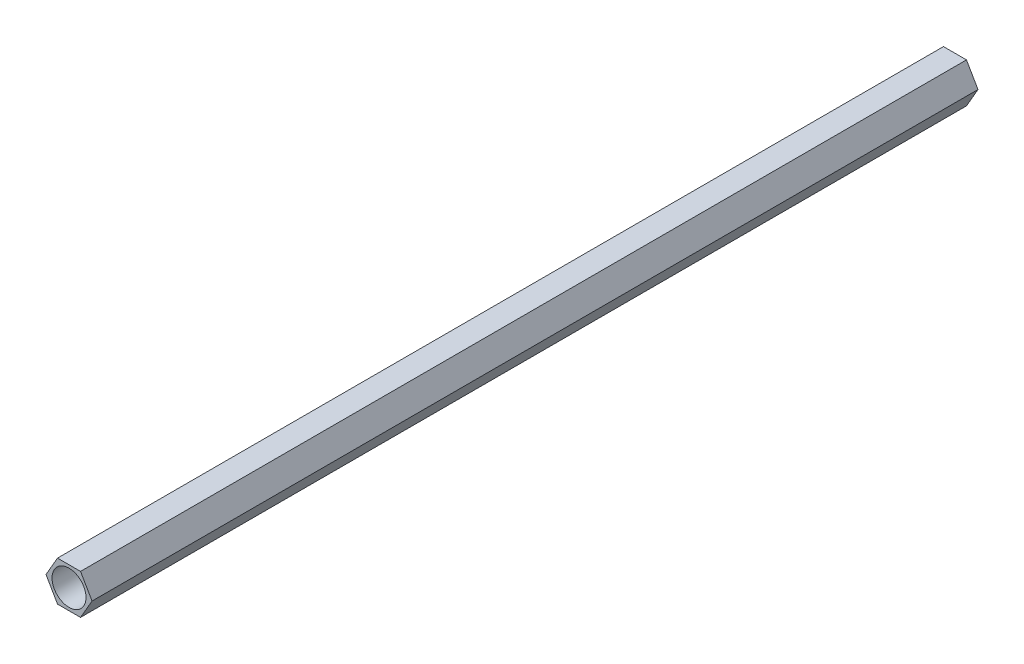
ISO-10303-21;
HEADER;
FILE_DESCRIPTION(('STEP AP214'),'2;1');
FILE_NAME('part.step','',(''),(''),'','','');
FILE_SCHEMA(('AUTOMOTIVE_DESIGN { 1 0 10303 214 1 1 1 1 }'));
ENDSEC;
DATA;
#1=APPLICATION_CONTEXT('core data for automotive mechanical design processes');
#2=APPLICATION_PROTOCOL_DEFINITION('international standard','automotive_design',2000,#1);
#3=PRODUCT_CONTEXT('',#1,'mechanical');
#4=PRODUCT('Part','Part','',(#3));
#5=PRODUCT_RELATED_PRODUCT_CATEGORY('part','',(#4));
#6=PRODUCT_DEFINITION_FORMATION('','',#4);
#7=PRODUCT_DEFINITION_CONTEXT('part definition',#1,'design');
#8=PRODUCT_DEFINITION('design','',#6,#7);
#9=PRODUCT_DEFINITION_SHAPE('','',#8);
#10=(LENGTH_UNIT() NAMED_UNIT(*) SI_UNIT(.MILLI.,.METRE.));
#11=(NAMED_UNIT(*) PLANE_ANGLE_UNIT() SI_UNIT($,.RADIAN.));
#12=(NAMED_UNIT(*) SI_UNIT($,.STERADIAN.) SOLID_ANGLE_UNIT());
#13=UNCERTAINTY_MEASURE_WITH_UNIT(LENGTH_MEASURE(1.E-05),#10,'distance_accuracy_value','');
#14=(GEOMETRIC_REPRESENTATION_CONTEXT(3) GLOBAL_UNCERTAINTY_ASSIGNED_CONTEXT((#13)) GLOBAL_UNIT_ASSIGNED_CONTEXT((#10,
#11,#12)) REPRESENTATION_CONTEXT('',''));
#15=CARTESIAN_POINT('',(0.,0.,0.));
#16=DIRECTION('',(0.,0.,1.));
#17=DIRECTION('',(1.,0.,0.));
#18=AXIS2_PLACEMENT_3D('',#15,#16,#17);
#19=CARTESIAN_POINT('',(0.,0.,100.));
#20=DIRECTION('',(0.,0.,1.));
#21=DIRECTION('',(1.,0.,0.));
#22=AXIS2_PLACEMENT_3D('',#19,#20,#21);
#23=PLANE('',#22);
#24=DIRECTION('',(0.499999999999995,0.866025403784442,0.));
#25=VECTOR('',#24,1.);
#26=CARTESIAN_POINT('',(1.29903810567668,-2.24999999999998,100.));
#27=LINE('',#26,#25);
#28=CARTESIAN_POINT('',(1.29903810567668,-2.24999999999998,100.));
#29=VERTEX_POINT('',#28);
#30=CARTESIAN_POINT('',(2.59807621135331,0.,100.));
#31=VERTEX_POINT('',#30);
#32=EDGE_CURVE('E148',#29,#31,#27,.T.);
#33=ORIENTED_EDGE('',*,*,#32,.T.);
#34=DIRECTION('',(-0.500000000000001,0.866025403784438,0.));
#35=VECTOR('',#34,1.);
#36=CARTESIAN_POINT('',(2.59807621135331,0.,100.));
#37=LINE('',#36,#35);
#38=CARTESIAN_POINT('',(1.29903810567665,2.25,100.));
#39=VERTEX_POINT('',#38);
#40=EDGE_CURVE('E96',#31,#39,#37,.T.);
#41=ORIENTED_EDGE('',*,*,#40,.T.);
#42=DIRECTION('',(-1.,0.,0.));
#43=VECTOR('',#42,1.);
#44=CARTESIAN_POINT('',(1.29903810567665,2.25,100.));
#45=LINE('',#44,#43);
#46=CARTESIAN_POINT('',(-1.29903810567667,2.24999999999999,100.));
#47=VERTEX_POINT('',#46);
#48=EDGE_CURVE('E109',#39,#47,#45,.T.);
#49=ORIENTED_EDGE('',*,*,#48,.T.);
#50=DIRECTION('',(-0.499999999999995,-0.866025403784441,0.));
#51=VECTOR('',#50,1.);
#52=CARTESIAN_POINT('',(-1.29903810567667,2.24999999999999,100.));
#53=LINE('',#52,#51);
#54=CARTESIAN_POINT('',(-2.59807621135331,0.,100.));
#55=VERTEX_POINT('',#54);
#56=EDGE_CURVE('E103',#47,#55,#53,.T.);
#57=ORIENTED_EDGE('',*,*,#56,.T.);
#58=DIRECTION('',(0.500000000000007,-0.866025403784435,0.));
#59=VECTOR('',#58,1.);
#60=CARTESIAN_POINT('',(-2.59807621135331,0.,100.));
#61=LINE('',#60,#59);
#62=CARTESIAN_POINT('',(-1.29903810567664,-2.25000000000001,100.));
#63=VERTEX_POINT('',#62);
#64=EDGE_CURVE('E107',#55,#63,#61,.T.);
#65=ORIENTED_EDGE('',*,*,#64,.T.);
#66=DIRECTION('',(1.,0.,0.));
#67=VECTOR('',#66,1.);
#68=CARTESIAN_POINT('',(-1.29903810567664,-2.25000000000001,100.));
#69=LINE('',#68,#67);
#70=EDGE_CURVE('E59',#63,#29,#69,.T.);
#71=ORIENTED_EDGE('',*,*,#70,.T.);
#72=EDGE_LOOP('',(#33,#41,#49,#57,#65,#71));
#73=FACE_BOUND('',#72,.T.);
#74=CARTESIAN_POINT('',(0.,0.,100.));
#75=DIRECTION('',(0.,0.,1.));
#76=DIRECTION('',(1.,0.,0.));
#77=AXIS2_PLACEMENT_3D('',#74,#75,#76);
#78=CIRCLE('',#77,1.91714467905462);
#79=CARTESIAN_POINT('',(1.91714467905462,0.,100.));
#80=VERTEX_POINT('',#79);
#81=EDGE_CURVE('E136',#80,#80,#78,.T.);
#82=ORIENTED_EDGE('',*,*,#81,.F.);
#83=EDGE_LOOP('',(#82));
#84=FACE_BOUND('',#83,.T.);
#85=ADVANCED_FACE('F41',(#73,#84),#23,.T.);
#86=CARTESIAN_POINT('',(0.,0.,0.));
#87=DIRECTION('',(0.,0.,1.));
#88=DIRECTION('',(1.,0.,0.));
#89=AXIS2_PLACEMENT_3D('',#86,#87,#88);
#90=PLANE('',#89);
#91=DIRECTION('',(0.499999999999995,0.866025403784442,0.));
#92=VECTOR('',#91,1.);
#93=CARTESIAN_POINT('',(1.29903810567668,-2.24999999999998,0.));
#94=LINE('',#93,#92);
#95=CARTESIAN_POINT('',(1.29903810567668,-2.24999999999998,0.));
#96=VERTEX_POINT('',#95);
#97=CARTESIAN_POINT('',(2.59807621135331,0.,0.));
#98=VERTEX_POINT('',#97);
#99=EDGE_CURVE('E131',#96,#98,#94,.T.);
#100=ORIENTED_EDGE('',*,*,#99,.F.);
#101=DIRECTION('',(1.,0.,0.));
#102=VECTOR('',#101,1.);
#103=CARTESIAN_POINT('',(-1.29903810567664,-2.25000000000001,0.));
#104=LINE('',#103,#102);
#105=CARTESIAN_POINT('',(-1.29903810567664,-2.25000000000001,0.));
#106=VERTEX_POINT('',#105);
#107=EDGE_CURVE('E88',#106,#96,#104,.T.);
#108=ORIENTED_EDGE('',*,*,#107,.F.);
#109=DIRECTION('',(0.500000000000007,-0.866025403784435,0.));
#110=VECTOR('',#109,1.);
#111=CARTESIAN_POINT('',(-2.59807621135331,0.,0.));
#112=LINE('',#111,#110);
#113=CARTESIAN_POINT('',(-2.59807621135331,0.,0.));
#114=VERTEX_POINT('',#113);
#115=EDGE_CURVE('E82',#114,#106,#112,.T.);
#116=ORIENTED_EDGE('',*,*,#115,.F.);
#117=DIRECTION('',(-0.499999999999995,-0.866025403784441,0.));
#118=VECTOR('',#117,1.);
#119=CARTESIAN_POINT('',(-1.29903810567667,2.24999999999999,0.));
#120=LINE('',#119,#118);
#121=CARTESIAN_POINT('',(-1.29903810567667,2.24999999999999,0.));
#122=VERTEX_POINT('',#121);
#123=EDGE_CURVE('E118',#122,#114,#120,.T.);
#124=ORIENTED_EDGE('',*,*,#123,.F.);
#125=DIRECTION('',(-1.,0.,0.));
#126=VECTOR('',#125,1.);
#127=CARTESIAN_POINT('',(1.29903810567665,2.25,0.));
#128=LINE('',#127,#126);
#129=CARTESIAN_POINT('',(1.29903810567665,2.25,0.));
#130=VERTEX_POINT('',#129);
#131=EDGE_CURVE('E139',#130,#122,#128,.T.);
#132=ORIENTED_EDGE('',*,*,#131,.F.);
#133=DIRECTION('',(-0.500000000000001,0.866025403784438,0.));
#134=VECTOR('',#133,1.);
#135=CARTESIAN_POINT('',(2.59807621135331,0.,0.));
#136=LINE('',#135,#134);
#137=EDGE_CURVE('E135',#98,#130,#136,.T.);
#138=ORIENTED_EDGE('',*,*,#137,.F.);
#139=EDGE_LOOP('',(#100,#108,#116,#124,#132,#138));
#140=FACE_BOUND('',#139,.T.);
#141=CARTESIAN_POINT('',(0.,0.,0.));
#142=DIRECTION('',(0.,0.,1.));
#143=DIRECTION('',(1.,0.,0.));
#144=AXIS2_PLACEMENT_3D('',#141,#142,#143);
#145=CIRCLE('',#144,1.91714467905462);
#146=CARTESIAN_POINT('',(1.91714467905462,0.,0.));
#147=VERTEX_POINT('',#146);
#148=EDGE_CURVE('E245',#147,#147,#145,.T.);
#149=ORIENTED_EDGE('',*,*,#148,.T.);
#150=EDGE_LOOP('',(#149));
#151=FACE_BOUND('',#150,.T.);
#152=ADVANCED_FACE('F161',(#140,#151),#90,.F.);
#153=CARTESIAN_POINT('',(1.29903810567668,-2.24999999999998,100.));
#154=DIRECTION('',(-0.866025403784442,0.499999999999995,0.));
#155=DIRECTION('',(-0.499999999999995,-0.866025403784442,0.));
#156=AXIS2_PLACEMENT_3D('',#153,#154,#155);
#157=PLANE('',#156);
#158=ORIENTED_EDGE('',*,*,#99,.T.);
#159=DIRECTION('',(0.,0.,-1.));
#160=VECTOR('',#159,1.);
#161=CARTESIAN_POINT('',(2.59807621135331,0.,100.));
#162=LINE('',#161,#160);
#163=EDGE_CURVE('E11',#31,#98,#162,.T.);
#164=ORIENTED_EDGE('',*,*,#163,.F.);
#165=ORIENTED_EDGE('',*,*,#32,.F.);
#166=DIRECTION('',(0.,0.,-1.));
#167=VECTOR('',#166,1.);
#168=CARTESIAN_POINT('',(1.29903810567668,-2.24999999999998,100.));
#169=LINE('',#168,#167);
#170=EDGE_CURVE('E127',#29,#96,#169,.T.);
#171=ORIENTED_EDGE('',*,*,#170,.T.);
#172=EDGE_LOOP('',(#158,#164,#165,#171));
#173=FACE_BOUND('',#172,.T.);
#174=ADVANCED_FACE('F43',(#173),#157,.F.);
#175=CARTESIAN_POINT('',(2.59807621135331,0.,100.));
#176=DIRECTION('',(-0.866025403784438,-0.500000000000001,0.));
#177=DIRECTION('',(0.500000000000001,-0.866025403784438,0.));
#178=AXIS2_PLACEMENT_3D('',#175,#176,#177);
#179=PLANE('',#178);
#180=ORIENTED_EDGE('',*,*,#137,.T.);
#181=DIRECTION('',(0.,0.,-1.));
#182=VECTOR('',#181,1.);
#183=CARTESIAN_POINT('',(1.29903810567665,2.25,100.));
#184=LINE('',#183,#182);
#185=EDGE_CURVE('E51',#39,#130,#184,.T.);
#186=ORIENTED_EDGE('',*,*,#185,.F.);
#187=ORIENTED_EDGE('',*,*,#40,.F.);
#188=ORIENTED_EDGE('',*,*,#163,.T.);
#189=EDGE_LOOP('',(#180,#186,#187,#188));
#190=FACE_BOUND('',#189,.T.);
#191=ADVANCED_FACE('F186',(#190),#179,.F.);
#192=CARTESIAN_POINT('',(1.29903810567665,2.25,100.));
#193=DIRECTION('',(0.,-1.,0.));
#194=DIRECTION('',(1.,0.,0.));
#195=AXIS2_PLACEMENT_3D('',#192,#193,#194);
#196=PLANE('',#195);
#197=ORIENTED_EDGE('',*,*,#131,.T.);
#198=DIRECTION('',(0.,0.,-1.));
#199=VECTOR('',#198,1.);
#200=CARTESIAN_POINT('',(-1.29903810567667,2.24999999999999,100.));
#201=LINE('',#200,#199);
#202=EDGE_CURVE('E120',#47,#122,#201,.T.);
#203=ORIENTED_EDGE('',*,*,#202,.F.);
#204=ORIENTED_EDGE('',*,*,#48,.F.);
#205=ORIENTED_EDGE('',*,*,#185,.T.);
#206=EDGE_LOOP('',(#197,#203,#204,#205));
#207=FACE_BOUND('',#206,.T.);
#208=ADVANCED_FACE('F158',(#207),#196,.F.);
#209=CARTESIAN_POINT('',(-1.29903810567667,2.24999999999999,100.));
#210=DIRECTION('',(0.866025403784442,-0.499999999999995,0.));
#211=DIRECTION('',(0.499999999999995,0.866025403784442,0.));
#212=AXIS2_PLACEMENT_3D('',#209,#210,#211);
#213=PLANE('',#212);
#214=ORIENTED_EDGE('',*,*,#123,.T.);
#215=DIRECTION('',(0.,0.,-1.));
#216=VECTOR('',#215,1.);
#217=CARTESIAN_POINT('',(-2.59807621135331,0.,100.));
#218=LINE('',#217,#216);
#219=EDGE_CURVE('E115',#55,#114,#218,.T.);
#220=ORIENTED_EDGE('',*,*,#219,.F.);
#221=ORIENTED_EDGE('',*,*,#56,.F.);
#222=ORIENTED_EDGE('',*,*,#202,.T.);
#223=EDGE_LOOP('',(#214,#220,#221,#222));
#224=FACE_BOUND('',#223,.T.);
#225=ADVANCED_FACE('F116',(#224),#213,.F.);
#226=CARTESIAN_POINT('',(-2.59807621135331,0.,100.));
#227=DIRECTION('',(0.866025403784435,0.500000000000007,0.));
#228=DIRECTION('',(-0.500000000000007,0.866025403784435,0.));
#229=AXIS2_PLACEMENT_3D('',#226,#227,#228);
#230=PLANE('',#229);
#231=ORIENTED_EDGE('',*,*,#115,.T.);
#232=DIRECTION('',(0.,0.,-1.));
#233=VECTOR('',#232,1.);
#234=CARTESIAN_POINT('',(-1.29903810567664,-2.25000000000001,100.));
#235=LINE('',#234,#233);
#236=EDGE_CURVE('E121',#63,#106,#235,.T.);
#237=ORIENTED_EDGE('',*,*,#236,.F.);
#238=ORIENTED_EDGE('',*,*,#64,.F.);
#239=ORIENTED_EDGE('',*,*,#219,.T.);
#240=EDGE_LOOP('',(#231,#237,#238,#239));
#241=FACE_BOUND('',#240,.T.);
#242=ADVANCED_FACE('F123',(#241),#230,.F.);
#243=CARTESIAN_POINT('',(-1.29903810567664,-2.25000000000001,100.));
#244=DIRECTION('',(0.,1.,0.));
#245=DIRECTION('',(-1.,0.,0.));
#246=AXIS2_PLACEMENT_3D('',#243,#244,#245);
#247=PLANE('',#246);
#248=ORIENTED_EDGE('',*,*,#107,.T.);
#249=ORIENTED_EDGE('',*,*,#170,.F.);
#250=ORIENTED_EDGE('',*,*,#70,.F.);
#251=ORIENTED_EDGE('',*,*,#236,.T.);
#252=EDGE_LOOP('',(#248,#249,#250,#251));
#253=FACE_BOUND('',#252,.T.);
#254=ADVANCED_FACE('F166',(#253),#247,.F.);
#255=CARTESIAN_POINT('',(0.,0.,100.));
#256=DIRECTION('',(0.,0.,-1.));
#257=DIRECTION('',(-1.,0.,0.));
#258=AXIS2_PLACEMENT_3D('',#255,#256,#257);
#259=CYLINDRICAL_SURFACE('',#258,1.91714467905462);
#260=ORIENTED_EDGE('',*,*,#81,.T.);
#261=EDGE_LOOP('',(#260));
#262=FACE_BOUND('',#261,.T.);
#263=ORIENTED_EDGE('',*,*,#148,.F.);
#264=EDGE_LOOP('',(#263));
#265=FACE_BOUND('',#264,.T.);
#266=ADVANCED_FACE('F168',(#262,#265),#259,.F.);
#267=CLOSED_SHELL('',(#85,#152,#174,#191,#208,#225,#242,#254,#266));
#268=MANIFOLD_SOLID_BREP('B2',#267);
#269=ADVANCED_BREP_SHAPE_REPRESENTATION('',(#18,#268),#14);
#270=SHAPE_DEFINITION_REPRESENTATION(#9,#269);
ENDSEC;
END-ISO-10303-21;
